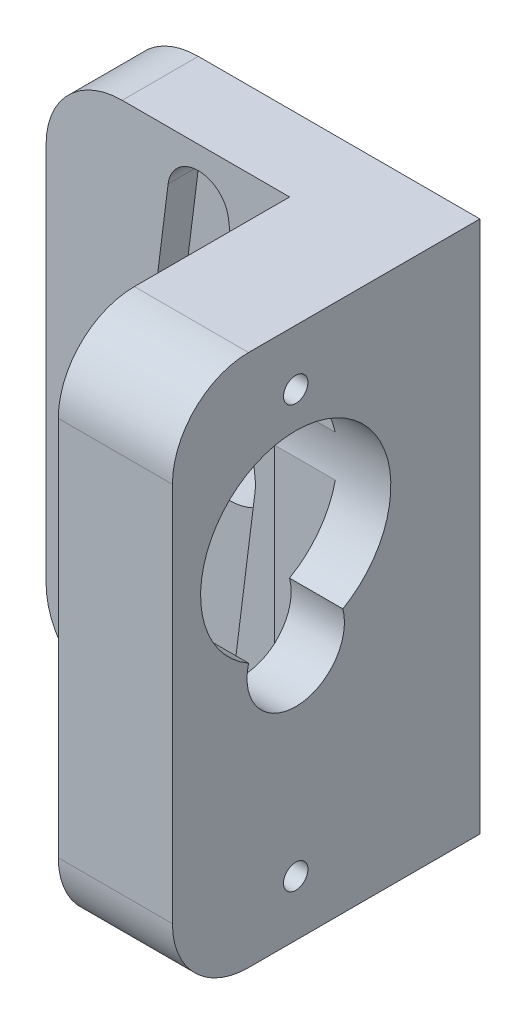
ISO-10303-21;
HEADER;
FILE_DESCRIPTION(('STEP AP214'),'2;1');
FILE_NAME('part.step','',(''),(''),'','','');
FILE_SCHEMA(('AUTOMOTIVE_DESIGN { 1 0 10303 214 1 1 1 1 }'));
ENDSEC;
DATA;
#1=APPLICATION_CONTEXT('core data for automotive mechanical design processes');
#2=APPLICATION_PROTOCOL_DEFINITION('international standard','automotive_design',2000,#1);
#3=PRODUCT_CONTEXT('',#1,'mechanical');
#4=PRODUCT('Part','Part','',(#3));
#5=PRODUCT_RELATED_PRODUCT_CATEGORY('part','',(#4));
#6=PRODUCT_DEFINITION_FORMATION('','',#4);
#7=PRODUCT_DEFINITION_CONTEXT('part definition',#1,'design');
#8=PRODUCT_DEFINITION('design','',#6,#7);
#9=PRODUCT_DEFINITION_SHAPE('','',#8);
#10=(LENGTH_UNIT() NAMED_UNIT(*) SI_UNIT(.MILLI.,.METRE.));
#11=(NAMED_UNIT(*) PLANE_ANGLE_UNIT() SI_UNIT($,.RADIAN.));
#12=(NAMED_UNIT(*) SI_UNIT($,.STERADIAN.) SOLID_ANGLE_UNIT());
#13=UNCERTAINTY_MEASURE_WITH_UNIT(LENGTH_MEASURE(1.E-05),#10,'distance_accuracy_value','');
#14=(GEOMETRIC_REPRESENTATION_CONTEXT(3) GLOBAL_UNCERTAINTY_ASSIGNED_CONTEXT((#13)) GLOBAL_UNIT_ASSIGNED_CONTEXT((#10,
#11,#12)) REPRESENTATION_CONTEXT('',''));
#15=CARTESIAN_POINT('',(0.,0.,0.));
#16=DIRECTION('',(0.,0.,1.));
#17=DIRECTION('',(1.,0.,0.));
#18=AXIS2_PLACEMENT_3D('',#15,#16,#17);
#19=CARTESIAN_POINT('',(-5.,12.5,0.));
#20=DIRECTION('',(0.,0.,1.));
#21=DIRECTION('',(1.,0.,0.));
#22=AXIS2_PLACEMENT_3D('',#19,#20,#21);
#23=PLANE('',#22);
#24=DIRECTION('',(-0.125,-0.992156741649221,0.));
#25=VECTOR('',#24,1.);
#26=CARTESIAN_POINT('',(-1.98431348329844,14.25,0.));
#27=LINE('',#26,#25);
#28=CARTESIAN_POINT('',(-1.98431348329844,14.25,0.));
#29=VERTEX_POINT('',#28);
#30=CARTESIAN_POINT('',(-3.72058778118458,0.46875,0.));
#31=VERTEX_POINT('',#30);
#32=EDGE_CURVE('E349',#29,#31,#27,.T.);
#33=ORIENTED_EDGE('',*,*,#32,.F.);
#34=CARTESIAN_POINT('',(0.,14.,0.));
#35=DIRECTION('',(0.,0.,1.));
#36=DIRECTION('',(1.,0.,0.));
#37=AXIS2_PLACEMENT_3D('',#34,#35,#36);
#38=CIRCLE('',#37,2.);
#39=CARTESIAN_POINT('',(1.98431348329844,14.25,0.));
#40=VERTEX_POINT('',#39);
#41=EDGE_CURVE('E373',#40,#29,#38,.T.);
#42=ORIENTED_EDGE('',*,*,#41,.F.);
#43=DIRECTION('',(-0.125,0.992156741649221,0.));
#44=VECTOR('',#43,1.);
#45=CARTESIAN_POINT('',(1.98431348329844,14.25,0.));
#46=LINE('',#45,#44);
#47=CARTESIAN_POINT('',(3.72058778118458,0.46875,0.));
#48=VERTEX_POINT('',#47);
#49=EDGE_CURVE('E370',#48,#40,#46,.T.);
#50=ORIENTED_EDGE('',*,*,#49,.F.);
#51=CARTESIAN_POINT('',(0.,0.,0.));
#52=DIRECTION('',(0.,0.,1.));
#53=DIRECTION('',(1.,0.,0.));
#54=AXIS2_PLACEMENT_3D('',#51,#52,#53);
#55=CIRCLE('',#54,3.75);
#56=CARTESIAN_POINT('',(3.72058778118458,-0.468750000000001,0.));
#57=VERTEX_POINT('',#56);
#58=EDGE_CURVE('E380',#57,#48,#55,.T.);
#59=ORIENTED_EDGE('',*,*,#58,.F.);
#60=DIRECTION('',(0.125,0.992156741649221,0.));
#61=VECTOR('',#60,1.);
#62=CARTESIAN_POINT('',(1.98431348329844,-14.25,0.));
#63=LINE('',#62,#61);
#64=CARTESIAN_POINT('',(1.98431348329844,-14.25,0.));
#65=VERTEX_POINT('',#64);
#66=EDGE_CURVE('E368',#65,#57,#63,.T.);
#67=ORIENTED_EDGE('',*,*,#66,.F.);
#68=CARTESIAN_POINT('',(0.,-14.,0.));
#69=DIRECTION('',(0.,0.,1.));
#70=DIRECTION('',(1.,0.,0.));
#71=AXIS2_PLACEMENT_3D('',#68,#69,#70);
#72=CIRCLE('',#71,2.);
#73=CARTESIAN_POINT('',(-1.98431348329844,-14.25,0.));
#74=VERTEX_POINT('',#73);
#75=EDGE_CURVE('E365',#74,#65,#72,.T.);
#76=ORIENTED_EDGE('',*,*,#75,.F.);
#77=DIRECTION('',(0.125,-0.992156741649221,0.));
#78=VECTOR('',#77,1.);
#79=CARTESIAN_POINT('',(-3.72058778118458,-0.46875,0.));
#80=LINE('',#79,#78);
#81=CARTESIAN_POINT('',(-3.72058778118458,-0.46875,0.));
#82=VERTEX_POINT('',#81);
#83=EDGE_CURVE('E344',#82,#74,#80,.T.);
#84=ORIENTED_EDGE('',*,*,#83,.F.);
#85=EDGE_CURVE('E399',#31,#82,#55,.T.);
#86=ORIENTED_EDGE('',*,*,#85,.F.);
#87=EDGE_LOOP('',(#33,#42,#50,#59,#67,#76,#84,#86));
#88=FACE_BOUND('',#87,.T.);
#89=DIRECTION('',(1.,0.,0.));
#90=VECTOR('',#89,1.);
#91=CARTESIAN_POINT('',(10.,-17.5,0.));
#92=LINE('',#91,#90);
#93=CARTESIAN_POINT('',(-4.99999999999999,-17.5,0.));
#94=VERTEX_POINT('',#93);
#95=CARTESIAN_POINT('',(6.,-17.5,0.));
#96=VERTEX_POINT('',#95);
#97=EDGE_CURVE('E405',#94,#96,#92,.T.);
#98=ORIENTED_EDGE('',*,*,#97,.T.);
#99=DIRECTION('',(0.,1.,0.));
#100=VECTOR('',#99,1.);
#101=CARTESIAN_POINT('',(6.,12.5,0.));
#102=LINE('',#101,#100);
#103=CARTESIAN_POINT('',(6.,17.5,0.));
#104=VERTEX_POINT('',#103);
#105=EDGE_CURVE('E440',#96,#104,#102,.T.);
#106=ORIENTED_EDGE('',*,*,#105,.T.);
#107=DIRECTION('',(-1.,0.,0.));
#108=VECTOR('',#107,1.);
#109=CARTESIAN_POINT('',(10.,17.5,0.));
#110=LINE('',#109,#108);
#111=CARTESIAN_POINT('',(-5.,17.5,0.));
#112=VERTEX_POINT('',#111);
#113=EDGE_CURVE('E398',#104,#112,#110,.T.);
#114=ORIENTED_EDGE('',*,*,#113,.T.);
#115=CARTESIAN_POINT('',(-5.,12.5,0.));
#116=DIRECTION('',(0.,0.,1.));
#117=DIRECTION('',(1.,0.,0.));
#118=AXIS2_PLACEMENT_3D('',#115,#116,#117);
#119=CIRCLE('',#118,5.);
#120=CARTESIAN_POINT('',(-9.99999999999999,12.5,0.));
#121=VERTEX_POINT('',#120);
#122=EDGE_CURVE('E418',#112,#121,#119,.T.);
#123=ORIENTED_EDGE('',*,*,#122,.T.);
#124=DIRECTION('',(0.,-1.,0.));
#125=VECTOR('',#124,1.);
#126=CARTESIAN_POINT('',(-10.,-12.5,0.));
#127=LINE('',#126,#125);
#128=CARTESIAN_POINT('',(-10.,-12.5,0.));
#129=VERTEX_POINT('',#128);
#130=EDGE_CURVE('E421',#121,#129,#127,.T.);
#131=ORIENTED_EDGE('',*,*,#130,.T.);
#132=CARTESIAN_POINT('',(-5.,-12.5,0.));
#133=DIRECTION('',(0.,0.,1.));
#134=DIRECTION('',(-1.,0.,0.));
#135=AXIS2_PLACEMENT_3D('',#132,#133,#134);
#136=CIRCLE('',#135,5.);
#137=EDGE_CURVE('E424',#129,#94,#136,.T.);
#138=ORIENTED_EDGE('',*,*,#137,.T.);
#139=EDGE_LOOP('',(#98,#106,#114,#123,#131,#138));
#140=FACE_BOUND('',#139,.T.);
#141=ADVANCED_FACE('F42',(#88,#140),#23,.T.);
#142=CARTESIAN_POINT('',(0.,0.,-5.));
#143=DIRECTION('',(0.,0.,1.));
#144=DIRECTION('',(1.,0.,0.));
#145=AXIS2_PLACEMENT_3D('',#142,#143,#144);
#146=CYLINDRICAL_SURFACE('',#145,3.75);
#147=CARTESIAN_POINT('',(0.,0.,-5.));
#148=DIRECTION('',(0.,0.,1.));
#149=DIRECTION('',(1.,0.,0.));
#150=AXIS2_PLACEMENT_3D('',#147,#148,#149);
#151=CIRCLE('',#150,3.75);
#152=CARTESIAN_POINT('',(3.75,0.,-5.));
#153=VERTEX_POINT('',#152);
#154=EDGE_CURVE('E395',#153,#153,#151,.T.);
#155=ORIENTED_EDGE('',*,*,#154,.F.);
#156=EDGE_LOOP('',(#155));
#157=FACE_BOUND('',#156,.T.);
#158=CARTESIAN_POINT('',(0.,0.,-2.));
#159=DIRECTION('',(0.,0.,1.));
#160=DIRECTION('',(1.,0.,0.));
#161=AXIS2_PLACEMENT_3D('',#158,#159,#160);
#162=CIRCLE('',#161,3.75);
#163=CARTESIAN_POINT('',(3.72058778118458,-0.468750000000001,-2.));
#164=VERTEX_POINT('',#163);
#165=CARTESIAN_POINT('',(-3.72058778118458,-0.46875,-2.));
#166=VERTEX_POINT('',#165);
#167=EDGE_CURVE('E438',#164,#166,#162,.F.);
#168=ORIENTED_EDGE('',*,*,#167,.F.);
#169=DIRECTION('',(0.,0.,1.));
#170=VECTOR('',#169,1.);
#171=CARTESIAN_POINT('',(3.72058778118458,-0.468750000000001,-2.));
#172=LINE('',#171,#170);
#173=EDGE_CURVE('E387',#164,#57,#172,.T.);
#174=ORIENTED_EDGE('',*,*,#173,.T.);
#175=ORIENTED_EDGE('',*,*,#58,.T.);
#176=DIRECTION('',(0.,0.,1.));
#177=VECTOR('',#176,1.);
#178=CARTESIAN_POINT('',(3.72058778118458,0.46875,-2.));
#179=LINE('',#178,#177);
#180=CARTESIAN_POINT('',(3.72058778118458,0.46875,-2.));
#181=VERTEX_POINT('',#180);
#182=EDGE_CURVE('E385',#181,#48,#179,.T.);
#183=ORIENTED_EDGE('',*,*,#182,.F.);
#184=CARTESIAN_POINT('',(-3.72058778118458,0.46875,-2.));
#185=VERTEX_POINT('',#184);
#186=EDGE_CURVE('E431',#185,#181,#162,.F.);
#187=ORIENTED_EDGE('',*,*,#186,.F.);
#188=DIRECTION('',(0.,0.,1.));
#189=VECTOR('',#188,1.);
#190=CARTESIAN_POINT('',(-3.72058778118458,0.46875,-2.));
#191=LINE('',#190,#189);
#192=EDGE_CURVE('E377',#185,#31,#191,.T.);
#193=ORIENTED_EDGE('',*,*,#192,.T.);
#194=ORIENTED_EDGE('',*,*,#85,.T.);
#195=DIRECTION('',(0.,0.,1.));
#196=VECTOR('',#195,1.);
#197=CARTESIAN_POINT('',(-3.72058778118458,-0.46875,-2.));
#198=LINE('',#197,#196);
#199=EDGE_CURVE('E362',#166,#82,#198,.T.);
#200=ORIENTED_EDGE('',*,*,#199,.F.);
#201=EDGE_LOOP('',(#168,#174,#175,#183,#187,#193,#194,#200));
#202=FACE_BOUND('',#201,.T.);
#203=ADVANCED_FACE('F483',(#157,#202),#146,.F.);
#204=CARTESIAN_POINT('',(10.,-17.5,-5.));
#205=DIRECTION('',(0.,-1.,0.));
#206=DIRECTION('',(1.,0.,0.));
#207=AXIS2_PLACEMENT_3D('',#204,#205,#206);
#208=PLANE('',#207);
#209=DIRECTION('',(0.,0.,-1.));
#210=VECTOR('',#209,1.);
#211=CARTESIAN_POINT('',(6.,-17.5,-5.));
#212=LINE('',#211,#210);
#213=CARTESIAN_POINT('',(6.,-17.5,10.2));
#214=VERTEX_POINT('',#213);
#215=EDGE_CURVE('E301',#214,#96,#212,.T.);
#216=ORIENTED_EDGE('',*,*,#215,.T.);
#217=ORIENTED_EDGE('',*,*,#97,.F.);
#218=DIRECTION('',(0.,0.,1.));
#219=VECTOR('',#218,1.);
#220=CARTESIAN_POINT('',(-4.99999999999999,-17.5,-5.));
#221=LINE('',#220,#219);
#222=CARTESIAN_POINT('',(-4.99999999999999,-17.5,-5.));
#223=VERTEX_POINT('',#222);
#224=EDGE_CURVE('E429',#223,#94,#221,.T.);
#225=ORIENTED_EDGE('',*,*,#224,.F.);
#226=DIRECTION('',(1.,0.,0.));
#227=VECTOR('',#226,1.);
#228=CARTESIAN_POINT('',(10.,-17.5,-5.));
#229=LINE('',#228,#227);
#230=CARTESIAN_POINT('',(13.5,-17.5,-5.));
#231=VERTEX_POINT('',#230);
#232=EDGE_CURVE('E414',#223,#231,#229,.T.);
#233=ORIENTED_EDGE('',*,*,#232,.T.);
#234=DIRECTION('',(0.,0.,-1.));
#235=VECTOR('',#234,1.);
#236=CARTESIAN_POINT('',(13.5,-17.5,-5.));
#237=LINE('',#236,#235);
#238=CARTESIAN_POINT('',(13.5,-17.5,10.2));
#239=VERTEX_POINT('',#238);
#240=EDGE_CURVE('E332',#239,#231,#237,.T.);
#241=ORIENTED_EDGE('',*,*,#240,.F.);
#242=DIRECTION('',(-1.,0.,0.));
#243=VECTOR('',#242,1.);
#244=CARTESIAN_POINT('',(13.5,-17.5,10.2));
#245=LINE('',#244,#243);
#246=EDGE_CURVE('E335',#239,#214,#245,.T.);
#247=ORIENTED_EDGE('',*,*,#246,.T.);
#248=EDGE_LOOP('',(#216,#217,#225,#233,#241,#247));
#249=FACE_BOUND('',#248,.T.);
#250=ADVANCED_FACE('F489',(#249),#208,.T.);
#251=CARTESIAN_POINT('',(-5.,-12.5,-5.));
#252=DIRECTION('',(0.,0.,1.));
#253=DIRECTION('',(1.,0.,0.));
#254=AXIS2_PLACEMENT_3D('',#251,#252,#253);
#255=CYLINDRICAL_SURFACE('',#254,5.);
#256=ORIENTED_EDGE('',*,*,#137,.F.);
#257=DIRECTION('',(0.,0.,1.));
#258=VECTOR('',#257,1.);
#259=CARTESIAN_POINT('',(-10.,-12.5,-5.));
#260=LINE('',#259,#258);
#261=CARTESIAN_POINT('',(-10.,-12.5,-5.));
#262=VERTEX_POINT('',#261);
#263=EDGE_CURVE('E432',#262,#129,#260,.T.);
#264=ORIENTED_EDGE('',*,*,#263,.F.);
#265=CARTESIAN_POINT('',(-5.,-12.5,-5.));
#266=DIRECTION('',(0.,0.,1.));
#267=DIRECTION('',(-1.,0.,0.));
#268=AXIS2_PLACEMENT_3D('',#265,#266,#267);
#269=CIRCLE('',#268,5.);
#270=EDGE_CURVE('E411',#262,#223,#269,.T.);
#271=ORIENTED_EDGE('',*,*,#270,.T.);
#272=ORIENTED_EDGE('',*,*,#224,.T.);
#273=EDGE_LOOP('',(#256,#264,#271,#272));
#274=FACE_BOUND('',#273,.T.);
#275=ADVANCED_FACE('F499',(#274),#255,.T.);
#276=CARTESIAN_POINT('',(-10.,-12.5,-5.));
#277=DIRECTION('',(-1.,0.,0.));
#278=DIRECTION('',(0.,-1.,0.));
#279=AXIS2_PLACEMENT_3D('',#276,#277,#278);
#280=PLANE('',#279);
#281=ORIENTED_EDGE('',*,*,#130,.F.);
#282=DIRECTION('',(0.,0.,1.));
#283=VECTOR('',#282,1.);
#284=CARTESIAN_POINT('',(-9.99999999999999,12.5,-5.));
#285=LINE('',#284,#283);
#286=CARTESIAN_POINT('',(-9.99999999999999,12.5,-5.));
#287=VERTEX_POINT('',#286);
#288=EDGE_CURVE('E434',#287,#121,#285,.T.);
#289=ORIENTED_EDGE('',*,*,#288,.F.);
#290=DIRECTION('',(0.,-1.,0.));
#291=VECTOR('',#290,1.);
#292=CARTESIAN_POINT('',(-10.,-12.5,-5.));
#293=LINE('',#292,#291);
#294=EDGE_CURVE('E408',#287,#262,#293,.T.);
#295=ORIENTED_EDGE('',*,*,#294,.T.);
#296=ORIENTED_EDGE('',*,*,#263,.T.);
#297=EDGE_LOOP('',(#281,#289,#295,#296));
#298=FACE_BOUND('',#297,.T.);
#299=ADVANCED_FACE('F503',(#298),#280,.T.);
#300=CARTESIAN_POINT('',(-5.,12.5,-5.));
#301=DIRECTION('',(0.,0.,1.));
#302=DIRECTION('',(1.,0.,0.));
#303=AXIS2_PLACEMENT_3D('',#300,#301,#302);
#304=CYLINDRICAL_SURFACE('',#303,5.);
#305=ORIENTED_EDGE('',*,*,#122,.F.);
#306=DIRECTION('',(0.,0.,1.));
#307=VECTOR('',#306,1.);
#308=CARTESIAN_POINT('',(-5.,17.5,-5.));
#309=LINE('',#308,#307);
#310=CARTESIAN_POINT('',(-5.,17.5,-5.));
#311=VERTEX_POINT('',#310);
#312=EDGE_CURVE('E416',#311,#112,#309,.T.);
#313=ORIENTED_EDGE('',*,*,#312,.F.);
#314=CARTESIAN_POINT('',(-5.,12.5,-5.));
#315=DIRECTION('',(0.,0.,1.));
#316=DIRECTION('',(1.,0.,0.));
#317=AXIS2_PLACEMENT_3D('',#314,#315,#316);
#318=CIRCLE('',#317,5.);
#319=EDGE_CURVE('E404',#311,#287,#318,.T.);
#320=ORIENTED_EDGE('',*,*,#319,.T.);
#321=ORIENTED_EDGE('',*,*,#288,.T.);
#322=EDGE_LOOP('',(#305,#313,#320,#321));
#323=FACE_BOUND('',#322,.T.);
#324=ADVANCED_FACE('F506',(#323),#304,.T.);
#325=CARTESIAN_POINT('',(10.,17.5,-5.));
#326=DIRECTION('',(0.,1.,0.));
#327=DIRECTION('',(-1.,0.,0.));
#328=AXIS2_PLACEMENT_3D('',#325,#326,#327);
#329=PLANE('',#328);
#330=DIRECTION('',(-1.,0.,0.));
#331=VECTOR('',#330,1.);
#332=CARTESIAN_POINT('',(10.,17.5,-5.));
#333=LINE('',#332,#331);
#334=CARTESIAN_POINT('',(13.5,17.5,-5.));
#335=VERTEX_POINT('',#334);
#336=EDGE_CURVE('E402',#335,#311,#333,.T.);
#337=ORIENTED_EDGE('',*,*,#336,.T.);
#338=ORIENTED_EDGE('',*,*,#312,.T.);
#339=ORIENTED_EDGE('',*,*,#113,.F.);
#340=DIRECTION('',(0.,0.,1.));
#341=VECTOR('',#340,1.);
#342=CARTESIAN_POINT('',(6.,17.5,-5.));
#343=LINE('',#342,#341);
#344=CARTESIAN_POINT('',(6.,17.5,10.2));
#345=VERTEX_POINT('',#344);
#346=EDGE_CURVE('E290',#104,#345,#343,.T.);
#347=ORIENTED_EDGE('',*,*,#346,.T.);
#348=DIRECTION('',(-1.,0.,0.));
#349=VECTOR('',#348,1.);
#350=CARTESIAN_POINT('',(13.5,17.5,10.2));
#351=LINE('',#350,#349);
#352=CARTESIAN_POINT('',(13.5,17.5,10.2));
#353=VERTEX_POINT('',#352);
#354=EDGE_CURVE('E341',#353,#345,#351,.T.);
#355=ORIENTED_EDGE('',*,*,#354,.F.);
#356=DIRECTION('',(0.,0.,1.));
#357=VECTOR('',#356,1.);
#358=CARTESIAN_POINT('',(13.5,17.5,-5.));
#359=LINE('',#358,#357);
#360=EDGE_CURVE('E324',#335,#353,#359,.T.);
#361=ORIENTED_EDGE('',*,*,#360,.F.);
#362=EDGE_LOOP('',(#337,#338,#339,#347,#355,#361));
#363=FACE_BOUND('',#362,.T.);
#364=ADVANCED_FACE('F44',(#363),#329,.T.);
#365=CARTESIAN_POINT('',(-5.,12.5,-5.));
#366=DIRECTION('',(0.,0.,1.));
#367=DIRECTION('',(1.,0.,0.));
#368=AXIS2_PLACEMENT_3D('',#365,#366,#367);
#369=PLANE('',#368);
#370=DIRECTION('',(0.,1.,0.));
#371=VECTOR('',#370,1.);
#372=CARTESIAN_POINT('',(13.5,17.5,-5.));
#373=LINE('',#372,#371);
#374=EDGE_CURVE('E321',#231,#335,#373,.T.);
#375=ORIENTED_EDGE('',*,*,#374,.F.);
#376=ORIENTED_EDGE('',*,*,#232,.F.);
#377=ORIENTED_EDGE('',*,*,#270,.F.);
#378=ORIENTED_EDGE('',*,*,#294,.F.);
#379=ORIENTED_EDGE('',*,*,#319,.F.);
#380=ORIENTED_EDGE('',*,*,#336,.F.);
#381=EDGE_LOOP('',(#375,#376,#377,#378,#379,#380));
#382=FACE_BOUND('',#381,.T.);
#383=ORIENTED_EDGE('',*,*,#154,.T.);
#384=EDGE_LOOP('',(#383));
#385=FACE_BOUND('',#384,.T.);
#386=ADVANCED_FACE('F496',(#382,#385),#369,.F.);
#387=CARTESIAN_POINT('',(0.,0.,-2.));
#388=DIRECTION('',(0.,0.,1.));
#389=DIRECTION('',(1.,0.,0.));
#390=AXIS2_PLACEMENT_3D('',#387,#388,#389);
#391=PLANE('',#390);
#392=ORIENTED_EDGE('',*,*,#186,.T.);
#393=DIRECTION('',(-0.125,0.992156741649221,0.));
#394=VECTOR('',#393,1.);
#395=CARTESIAN_POINT('',(1.98431348329844,14.25,-2.));
#396=LINE('',#395,#394);
#397=CARTESIAN_POINT('',(1.98431348329844,14.25,-2.));
#398=VERTEX_POINT('',#397);
#399=EDGE_CURVE('E354',#181,#398,#396,.T.);
#400=ORIENTED_EDGE('',*,*,#399,.T.);
#401=CARTESIAN_POINT('',(0.,14.,-2.));
#402=DIRECTION('',(0.,0.,1.));
#403=DIRECTION('',(1.,0.,0.));
#404=AXIS2_PLACEMENT_3D('',#401,#402,#403);
#405=CIRCLE('',#404,2.);
#406=CARTESIAN_POINT('',(-1.98431348329844,14.25,-2.));
#407=VERTEX_POINT('',#406);
#408=EDGE_CURVE('E357',#398,#407,#405,.T.);
#409=ORIENTED_EDGE('',*,*,#408,.T.);
#410=DIRECTION('',(-0.125,-0.992156741649221,0.));
#411=VECTOR('',#410,1.);
#412=CARTESIAN_POINT('',(-1.98431348329844,14.25,-2.));
#413=LINE('',#412,#411);
#414=EDGE_CURVE('E360',#407,#185,#413,.T.);
#415=ORIENTED_EDGE('',*,*,#414,.T.);
#416=EDGE_LOOP('',(#392,#400,#409,#415));
#417=FACE_BOUND('',#416,.T.);
#418=ADVANCED_FACE('F567',(#417),#391,.T.);
#419=CARTESIAN_POINT('',(1.98431348329844,14.25,-2.));
#420=DIRECTION('',(0.992156741649222,0.125,0.));
#421=DIRECTION('',(-0.125,0.992156741649222,0.));
#422=AXIS2_PLACEMENT_3D('',#419,#420,#421);
#423=PLANE('',#422);
#424=ORIENTED_EDGE('',*,*,#49,.T.);
#425=DIRECTION('',(0.,0.,1.));
#426=VECTOR('',#425,1.);
#427=CARTESIAN_POINT('',(1.98431348329844,14.25,-2.));
#428=LINE('',#427,#426);
#429=EDGE_CURVE('E383',#398,#40,#428,.T.);
#430=ORIENTED_EDGE('',*,*,#429,.F.);
#431=ORIENTED_EDGE('',*,*,#399,.F.);
#432=ORIENTED_EDGE('',*,*,#182,.T.);
#433=EDGE_LOOP('',(#424,#430,#431,#432));
#434=FACE_BOUND('',#433,.T.);
#435=ADVANCED_FACE('F571',(#434),#423,.F.);
#436=CARTESIAN_POINT('',(-1.98431348329844,14.25,-2.));
#437=DIRECTION('',(-0.992156741649222,0.125,0.));
#438=DIRECTION('',(-0.125,-0.992156741649222,0.));
#439=AXIS2_PLACEMENT_3D('',#436,#437,#438);
#440=PLANE('',#439);
#441=ORIENTED_EDGE('',*,*,#32,.T.);
#442=ORIENTED_EDGE('',*,*,#192,.F.);
#443=ORIENTED_EDGE('',*,*,#414,.F.);
#444=DIRECTION('',(0.,0.,1.));
#445=VECTOR('',#444,1.);
#446=CARTESIAN_POINT('',(-1.98431348329844,14.25,-2.));
#447=LINE('',#446,#445);
#448=EDGE_CURVE('E381',#407,#29,#447,.T.);
#449=ORIENTED_EDGE('',*,*,#448,.T.);
#450=EDGE_LOOP('',(#441,#442,#443,#449));
#451=FACE_BOUND('',#450,.T.);
#452=ADVANCED_FACE('F568',(#451),#440,.F.);
#453=CARTESIAN_POINT('',(0.,14.,-2.));
#454=DIRECTION('',(0.,0.,1.));
#455=DIRECTION('',(1.,0.,0.));
#456=AXIS2_PLACEMENT_3D('',#453,#454,#455);
#457=CYLINDRICAL_SURFACE('',#456,2.);
#458=ORIENTED_EDGE('',*,*,#41,.T.);
#459=ORIENTED_EDGE('',*,*,#448,.F.);
#460=ORIENTED_EDGE('',*,*,#408,.F.);
#461=ORIENTED_EDGE('',*,*,#429,.T.);
#462=EDGE_LOOP('',(#458,#459,#460,#461));
#463=FACE_BOUND('',#462,.T.);
#464=ADVANCED_FACE('F565',(#463),#457,.F.);
#465=ORIENTED_EDGE('',*,*,#167,.T.);
#466=DIRECTION('',(0.125,-0.992156741649221,0.));
#467=VECTOR('',#466,1.);
#468=CARTESIAN_POINT('',(-3.72058778118458,-0.46875,-2.));
#469=LINE('',#468,#467);
#470=CARTESIAN_POINT('',(-1.98431348329844,-14.25,-2.));
#471=VERTEX_POINT('',#470);
#472=EDGE_CURVE('E345',#166,#471,#469,.T.);
#473=ORIENTED_EDGE('',*,*,#472,.T.);
#474=CARTESIAN_POINT('',(0.,-14.,-2.));
#475=DIRECTION('',(0.,0.,1.));
#476=DIRECTION('',(1.,0.,0.));
#477=AXIS2_PLACEMENT_3D('',#474,#475,#476);
#478=CIRCLE('',#477,2.);
#479=CARTESIAN_POINT('',(1.98431348329844,-14.25,-2.));
#480=VERTEX_POINT('',#479);
#481=EDGE_CURVE('E348',#471,#480,#478,.T.);
#482=ORIENTED_EDGE('',*,*,#481,.T.);
#483=DIRECTION('',(0.125,0.992156741649221,0.));
#484=VECTOR('',#483,1.);
#485=CARTESIAN_POINT('',(1.98431348329844,-14.25,-2.));
#486=LINE('',#485,#484);
#487=EDGE_CURVE('E352',#480,#164,#486,.T.);
#488=ORIENTED_EDGE('',*,*,#487,.T.);
#489=EDGE_LOOP('',(#465,#473,#482,#488));
#490=FACE_BOUND('',#489,.T.);
#491=ADVANCED_FACE('F561',(#490),#391,.T.);
#492=CARTESIAN_POINT('',(1.98431348329844,-14.25,-2.));
#493=DIRECTION('',(0.992156741649222,-0.125,0.));
#494=DIRECTION('',(0.125,0.992156741649222,0.));
#495=AXIS2_PLACEMENT_3D('',#492,#493,#494);
#496=PLANE('',#495);
#497=ORIENTED_EDGE('',*,*,#66,.T.);
#498=ORIENTED_EDGE('',*,*,#173,.F.);
#499=ORIENTED_EDGE('',*,*,#487,.F.);
#500=DIRECTION('',(0.,0.,1.));
#501=VECTOR('',#500,1.);
#502=CARTESIAN_POINT('',(1.98431348329844,-14.25,-2.));
#503=LINE('',#502,#501);
#504=EDGE_CURVE('E390',#480,#65,#503,.T.);
#505=ORIENTED_EDGE('',*,*,#504,.T.);
#506=EDGE_LOOP('',(#497,#498,#499,#505));
#507=FACE_BOUND('',#506,.T.);
#508=ADVANCED_FACE('F564',(#507),#496,.F.);
#509=CARTESIAN_POINT('',(0.,-14.,-2.));
#510=DIRECTION('',(0.,0.,1.));
#511=DIRECTION('',(1.,0.,0.));
#512=AXIS2_PLACEMENT_3D('',#509,#510,#511);
#513=CYLINDRICAL_SURFACE('',#512,2.);
#514=ORIENTED_EDGE('',*,*,#75,.T.);
#515=ORIENTED_EDGE('',*,*,#504,.F.);
#516=ORIENTED_EDGE('',*,*,#481,.F.);
#517=DIRECTION('',(0.,0.,1.));
#518=VECTOR('',#517,1.);
#519=CARTESIAN_POINT('',(-1.98431348329844,-14.25,-2.));
#520=LINE('',#519,#518);
#521=EDGE_CURVE('E392',#471,#74,#520,.T.);
#522=ORIENTED_EDGE('',*,*,#521,.T.);
#523=EDGE_LOOP('',(#514,#515,#516,#522));
#524=FACE_BOUND('',#523,.T.);
#525=ADVANCED_FACE('F581',(#524),#513,.F.);
#526=CARTESIAN_POINT('',(-3.72058778118458,-0.46875,-2.));
#527=DIRECTION('',(-0.992156741649222,-0.125,0.));
#528=DIRECTION('',(0.125,-0.992156741649222,0.));
#529=AXIS2_PLACEMENT_3D('',#526,#527,#528);
#530=PLANE('',#529);
#531=ORIENTED_EDGE('',*,*,#83,.T.);
#532=ORIENTED_EDGE('',*,*,#521,.F.);
#533=ORIENTED_EDGE('',*,*,#472,.F.);
#534=ORIENTED_EDGE('',*,*,#199,.T.);
#535=EDGE_LOOP('',(#531,#532,#533,#534));
#536=FACE_BOUND('',#535,.T.);
#537=ADVANCED_FACE('F585',(#536),#530,.F.);
#538=CARTESIAN_POINT('',(13.5,-12.5,10.2));
#539=DIRECTION('',(1.,0.,0.));
#540=DIRECTION('',(0.,0.,-1.));
#541=AXIS2_PLACEMENT_3D('',#538,#539,#540);
#542=PLANE('',#541);
#543=CARTESIAN_POINT('',(13.5,13.8499999999957,7.09999999999775));
#544=DIRECTION('',(1.,0.,0.));
#545=DIRECTION('',(0.,0.,-1.));
#546=AXIS2_PLACEMENT_3D('',#543,#544,#545);
#547=CIRCLE('',#546,0.7999999999991);
#548=CARTESIAN_POINT('',(13.5,13.8499999999957,6.29999999999865));
#549=VERTEX_POINT('',#548);
#550=EDGE_CURVE('E318',#549,#549,#547,.T.);
#551=ORIENTED_EDGE('',*,*,#550,.F.);
#552=EDGE_LOOP('',(#551));
#553=FACE_BOUND('',#552,.T.);
#554=ORIENTED_EDGE('',*,*,#374,.T.);
#555=ORIENTED_EDGE('',*,*,#360,.T.);
#556=CARTESIAN_POINT('',(13.5,12.5,10.2));
#557=DIRECTION('',(1.,0.,0.));
#558=DIRECTION('',(0.,0.,1.));
#559=AXIS2_PLACEMENT_3D('',#556,#557,#558);
#560=CIRCLE('',#559,5.);
#561=CARTESIAN_POINT('',(13.5,12.5,15.2));
#562=VERTEX_POINT('',#561);
#563=EDGE_CURVE('E326',#353,#562,#560,.T.);
#564=ORIENTED_EDGE('',*,*,#563,.T.);
#565=DIRECTION('',(0.,-1.,0.));
#566=VECTOR('',#565,1.);
#567=CARTESIAN_POINT('',(13.5,12.5,15.2));
#568=LINE('',#567,#566);
#569=CARTESIAN_POINT('',(13.5,-12.5,15.2));
#570=VERTEX_POINT('',#569);
#571=EDGE_CURVE('E328',#562,#570,#568,.T.);
#572=ORIENTED_EDGE('',*,*,#571,.T.);
#573=CARTESIAN_POINT('',(13.5,-12.5,10.2));
#574=DIRECTION('',(1.,0.,0.));
#575=DIRECTION('',(0.,0.,-1.));
#576=AXIS2_PLACEMENT_3D('',#573,#574,#575);
#577=CIRCLE('',#576,5.);
#578=EDGE_CURVE('E330',#570,#239,#577,.T.);
#579=ORIENTED_EDGE('',*,*,#578,.T.);
#580=ORIENTED_EDGE('',*,*,#240,.T.);
#581=EDGE_LOOP('',(#554,#555,#564,#572,#579,#580));
#582=FACE_BOUND('',#581,.T.);
#583=CARTESIAN_POINT('',(13.5,-13.8500000000043,7.09999999999774));
#584=DIRECTION('',(1.,0.,0.));
#585=DIRECTION('',(0.,0.,-1.));
#586=AXIS2_PLACEMENT_3D('',#583,#584,#585);
#587=CIRCLE('',#586,0.7999999999991);
#588=CARTESIAN_POINT('',(13.5,-13.8500000000043,6.29999999999864));
#589=VERTEX_POINT('',#588);
#590=EDGE_CURVE('E315',#589,#589,#587,.T.);
#591=ORIENTED_EDGE('',*,*,#590,.F.);
#592=EDGE_LOOP('',(#591));
#593=FACE_BOUND('',#592,.T.);
#594=CARTESIAN_POINT('',(13.5,5.24999999999129,7.09999999999775));
#595=DIRECTION('',(1.,0.,0.));
#596=DIRECTION('',(0.,0.,-1.));
#597=AXIS2_PLACEMENT_3D('',#594,#595,#596);
#598=CIRCLE('',#597,6.25);
#599=CARTESIAN_POINT('',(13.5,-0.180800000008717,4.00663429901767));
#600=VERTEX_POINT('',#599);
#601=CARTESIAN_POINT('',(13.5,-0.180800000008715,10.1933657009778));
#602=VERTEX_POINT('',#601);
#603=EDGE_CURVE('E307',#600,#602,#598,.T.);
#604=ORIENTED_EDGE('',*,*,#603,.F.);
#605=CARTESIAN_POINT('',(13.5,-1.00000000000871,7.09999999999775));
#606=DIRECTION('',(1.,0.,0.));
#607=DIRECTION('',(0.,0.,-1.));
#608=AXIS2_PLACEMENT_3D('',#605,#606,#607);
#609=CIRCLE('',#608,3.2);
#610=EDGE_CURVE('E304',#602,#600,#609,.T.);
#611=ORIENTED_EDGE('',*,*,#610,.F.);
#612=EDGE_LOOP('',(#604,#611));
#613=FACE_BOUND('',#612,.T.);
#614=ADVANCED_FACE('F542',(#553,#582,#593,#613),#542,.T.);
#615=CARTESIAN_POINT('',(13.5,12.5,10.2));
#616=DIRECTION('',(-1.,0.,0.));
#617=DIRECTION('',(0.,0.,1.));
#618=AXIS2_PLACEMENT_3D('',#615,#616,#617);
#619=CYLINDRICAL_SURFACE('',#618,5.);
#620=ORIENTED_EDGE('',*,*,#354,.T.);
#621=CARTESIAN_POINT('',(6.,12.5,10.2));
#622=DIRECTION('',(1.,0.,0.));
#623=DIRECTION('',(0.,0.,1.));
#624=AXIS2_PLACEMENT_3D('',#621,#622,#623);
#625=CIRCLE('',#624,5.);
#626=CARTESIAN_POINT('',(6.,12.5,15.2));
#627=VERTEX_POINT('',#626);
#628=EDGE_CURVE('E292',#345,#627,#625,.T.);
#629=ORIENTED_EDGE('',*,*,#628,.T.);
#630=DIRECTION('',(-1.,0.,0.));
#631=VECTOR('',#630,1.);
#632=CARTESIAN_POINT('',(13.5,12.5,15.2));
#633=LINE('',#632,#631);
#634=EDGE_CURVE('E339',#562,#627,#633,.T.);
#635=ORIENTED_EDGE('',*,*,#634,.F.);
#636=ORIENTED_EDGE('',*,*,#563,.F.);
#637=EDGE_LOOP('',(#620,#629,#635,#636));
#638=FACE_BOUND('',#637,.T.);
#639=ADVANCED_FACE('F538',(#638),#619,.T.);
#640=CARTESIAN_POINT('',(13.5,12.5,15.2));
#641=DIRECTION('',(0.,0.,-1.));
#642=DIRECTION('',(0.,1.,0.));
#643=AXIS2_PLACEMENT_3D('',#640,#641,#642);
#644=PLANE('',#643);
#645=ORIENTED_EDGE('',*,*,#634,.T.);
#646=DIRECTION('',(0.,-1.,0.));
#647=VECTOR('',#646,1.);
#648=CARTESIAN_POINT('',(6.,12.5,15.2));
#649=LINE('',#648,#647);
#650=CARTESIAN_POINT('',(6.,-12.5,15.2));
#651=VERTEX_POINT('',#650);
#652=EDGE_CURVE('E295',#627,#651,#649,.T.);
#653=ORIENTED_EDGE('',*,*,#652,.T.);
#654=DIRECTION('',(-1.,0.,0.));
#655=VECTOR('',#654,1.);
#656=CARTESIAN_POINT('',(13.5,-12.5,15.2));
#657=LINE('',#656,#655);
#658=EDGE_CURVE('E337',#570,#651,#657,.T.);
#659=ORIENTED_EDGE('',*,*,#658,.F.);
#660=ORIENTED_EDGE('',*,*,#571,.F.);
#661=EDGE_LOOP('',(#645,#653,#659,#660));
#662=FACE_BOUND('',#661,.T.);
#663=ADVANCED_FACE('F549',(#662),#644,.F.);
#664=CARTESIAN_POINT('',(13.5,-12.5,10.2));
#665=DIRECTION('',(-1.,0.,0.));
#666=DIRECTION('',(0.,0.,1.));
#667=AXIS2_PLACEMENT_3D('',#664,#665,#666);
#668=CYLINDRICAL_SURFACE('',#667,5.);
#669=ORIENTED_EDGE('',*,*,#658,.T.);
#670=CARTESIAN_POINT('',(6.,-12.5,10.2));
#671=DIRECTION('',(1.,0.,0.));
#672=DIRECTION('',(0.,0.,-1.));
#673=AXIS2_PLACEMENT_3D('',#670,#671,#672);
#674=CIRCLE('',#673,5.);
#675=EDGE_CURVE('E298',#651,#214,#674,.T.);
#676=ORIENTED_EDGE('',*,*,#675,.T.);
#677=ORIENTED_EDGE('',*,*,#246,.F.);
#678=ORIENTED_EDGE('',*,*,#578,.F.);
#679=EDGE_LOOP('',(#669,#676,#677,#678));
#680=FACE_BOUND('',#679,.T.);
#681=ADVANCED_FACE('F547',(#680),#668,.T.);
#682=CARTESIAN_POINT('',(13.5,13.8499999999957,7.09999999999775));
#683=DIRECTION('',(-1.,0.,0.));
#684=DIRECTION('',(0.,0.,1.));
#685=AXIS2_PLACEMENT_3D('',#682,#683,#684);
#686=CYLINDRICAL_SURFACE('',#685,0.7999999999991);
#687=ORIENTED_EDGE('',*,*,#550,.T.);
#688=EDGE_LOOP('',(#687));
#689=FACE_BOUND('',#688,.T.);
#690=CARTESIAN_POINT('',(6.,13.8499999999957,7.09999999999775));
#691=DIRECTION('',(1.,0.,0.));
#692=DIRECTION('',(0.,0.,-1.));
#693=AXIS2_PLACEMENT_3D('',#690,#691,#692);
#694=CIRCLE('',#693,0.7999999999991);
#695=CARTESIAN_POINT('',(6.,13.8499999999957,6.29999999999865));
#696=VERTEX_POINT('',#695);
#697=EDGE_CURVE('E287',#696,#696,#694,.T.);
#698=ORIENTED_EDGE('',*,*,#697,.F.);
#699=EDGE_LOOP('',(#698));
#700=FACE_BOUND('',#699,.T.);
#701=ADVANCED_FACE('F556',(#689,#700),#686,.F.);
#702=CARTESIAN_POINT('',(13.5,-13.8500000000043,7.09999999999774));
#703=DIRECTION('',(-1.,0.,0.));
#704=DIRECTION('',(0.,0.,1.));
#705=AXIS2_PLACEMENT_3D('',#702,#703,#704);
#706=CYLINDRICAL_SURFACE('',#705,0.7999999999991);
#707=ORIENTED_EDGE('',*,*,#590,.T.);
#708=EDGE_LOOP('',(#707));
#709=FACE_BOUND('',#708,.T.);
#710=CARTESIAN_POINT('',(6.,-13.8500000000043,7.09999999999774));
#711=DIRECTION('',(1.,0.,0.));
#712=DIRECTION('',(0.,0.,-1.));
#713=AXIS2_PLACEMENT_3D('',#710,#711,#712);
#714=CIRCLE('',#713,0.7999999999991);
#715=CARTESIAN_POINT('',(6.,-13.8500000000043,6.29999999999864));
#716=VERTEX_POINT('',#715);
#717=EDGE_CURVE('E284',#716,#716,#714,.T.);
#718=ORIENTED_EDGE('',*,*,#717,.F.);
#719=EDGE_LOOP('',(#718));
#720=FACE_BOUND('',#719,.T.);
#721=ADVANCED_FACE('F772',(#709,#720),#706,.F.);
#722=CARTESIAN_POINT('',(13.5,-1.00000000000871,7.09999999999775));
#723=DIRECTION('',(-1.,0.,0.));
#724=DIRECTION('',(0.,0.,1.));
#725=AXIS2_PLACEMENT_3D('',#722,#723,#724);
#726=CYLINDRICAL_SURFACE('',#725,3.2);
#727=CARTESIAN_POINT('',(10.,-1.00000000000871,7.09999999999775));
#728=DIRECTION('',(1.,0.,0.));
#729=DIRECTION('',(0.,0.,-1.));
#730=AXIS2_PLACEMENT_3D('',#727,#728,#729);
#731=CIRCLE('',#730,3.2);
#732=CARTESIAN_POINT('',(10.,-0.180800000008715,10.1933657009778));
#733=VERTEX_POINT('',#732);
#734=CARTESIAN_POINT('',(10.,-0.180800000008717,4.00663429901767));
#735=VERTEX_POINT('',#734);
#736=EDGE_CURVE('E278',#733,#735,#731,.T.);
#737=ORIENTED_EDGE('',*,*,#736,.F.);
#738=DIRECTION('',(-1.,0.,0.));
#739=VECTOR('',#738,1.);
#740=CARTESIAN_POINT('',(13.5,-0.180800000008715,10.1933657009778));
#741=LINE('',#740,#739);
#742=EDGE_CURVE('E309',#602,#733,#741,.T.);
#743=ORIENTED_EDGE('',*,*,#742,.F.);
#744=ORIENTED_EDGE('',*,*,#610,.T.);
#745=DIRECTION('',(-1.,0.,0.));
#746=VECTOR('',#745,1.);
#747=CARTESIAN_POINT('',(13.5,-0.180800000008717,4.00663429901767));
#748=LINE('',#747,#746);
#749=EDGE_CURVE('E312',#600,#735,#748,.T.);
#750=ORIENTED_EDGE('',*,*,#749,.T.);
#751=EDGE_LOOP('',(#737,#743,#744,#750));
#752=FACE_BOUND('',#751,.T.);
#753=ADVANCED_FACE('F783',(#752),#726,.F.);
#754=CARTESIAN_POINT('',(13.5,5.24999999999129,7.09999999999775));
#755=DIRECTION('',(-1.,0.,0.));
#756=DIRECTION('',(0.,0.,1.));
#757=AXIS2_PLACEMENT_3D('',#754,#755,#756);
#758=CYLINDRICAL_SURFACE('',#757,6.25);
#759=DIRECTION('',(-1.,0.,0.));
#760=VECTOR('',#759,1.);
#761=CARTESIAN_POINT('',(13.5,6.61106575887294,13.1999999999977));
#762=LINE('',#761,#760);
#763=CARTESIAN_POINT('',(10.,6.61106575887294,13.1999999999977));
#764=VERTEX_POINT('',#763);
#765=CARTESIAN_POINT('',(6.,6.61106575887294,13.1999999999977));
#766=VERTEX_POINT('',#765);
#767=EDGE_CURVE('E276',#764,#766,#762,.T.);
#768=ORIENTED_EDGE('',*,*,#767,.F.);
#769=CARTESIAN_POINT('',(10.,5.24999999999129,7.09999999999775));
#770=DIRECTION('',(1.,0.,0.));
#771=DIRECTION('',(0.,0.,-1.));
#772=AXIS2_PLACEMENT_3D('',#769,#770,#771);
#773=CIRCLE('',#772,6.25);
#774=CARTESIAN_POINT('',(10.,6.61106575887288,0.999999999997741));
#775=VERTEX_POINT('',#774);
#776=EDGE_CURVE('E11',#775,#764,#773,.T.);
#777=ORIENTED_EDGE('',*,*,#776,.F.);
#778=DIRECTION('',(-1.,0.,0.));
#779=VECTOR('',#778,1.);
#780=CARTESIAN_POINT('',(13.5,6.61106575887288,0.999999999997741));
#781=LINE('',#780,#779);
#782=CARTESIAN_POINT('',(6.,6.61106575887288,0.999999999997741));
#783=VERTEX_POINT('',#782);
#784=EDGE_CURVE('E267',#783,#775,#781,.F.);
#785=ORIENTED_EDGE('',*,*,#784,.F.);
#786=CARTESIAN_POINT('',(6.,5.24999999999129,7.09999999999775));
#787=DIRECTION('',(1.,0.,0.));
#788=DIRECTION('',(0.,0.,-1.));
#789=AXIS2_PLACEMENT_3D('',#786,#787,#788);
#790=CIRCLE('',#789,6.25);
#791=CARTESIAN_POINT('',(6.,3.88893424110969,0.999999999997742));
#792=VERTEX_POINT('',#791);
#793=EDGE_CURVE('E283',#792,#783,#790,.T.);
#794=ORIENTED_EDGE('',*,*,#793,.F.);
#795=DIRECTION('',(-1.,0.,0.));
#796=VECTOR('',#795,1.);
#797=CARTESIAN_POINT('',(13.5,3.88893424110969,0.999999999997741));
#798=LINE('',#797,#796);
#799=CARTESIAN_POINT('',(10.,3.88893424110969,0.999999999997741));
#800=VERTEX_POINT('',#799);
#801=EDGE_CURVE('E66',#800,#792,#798,.T.);
#802=ORIENTED_EDGE('',*,*,#801,.F.);
#803=EDGE_CURVE('E46',#735,#800,#773,.T.);
#804=ORIENTED_EDGE('',*,*,#803,.F.);
#805=ORIENTED_EDGE('',*,*,#749,.F.);
#806=ORIENTED_EDGE('',*,*,#603,.T.);
#807=ORIENTED_EDGE('',*,*,#742,.T.);
#808=CARTESIAN_POINT('',(10.,3.88893424110963,13.1999999999977));
#809=VERTEX_POINT('',#808);
#810=EDGE_CURVE('E51',#809,#733,#773,.T.);
#811=ORIENTED_EDGE('',*,*,#810,.F.);
#812=DIRECTION('',(-1.,0.,0.));
#813=VECTOR('',#812,1.);
#814=CARTESIAN_POINT('',(13.5,3.88893424110963,13.1999999999977));
#815=LINE('',#814,#813);
#816=CARTESIAN_POINT('',(6.,3.88893424110964,13.1999999999977));
#817=VERTEX_POINT('',#816);
#818=EDGE_CURVE('E274',#817,#809,#815,.F.);
#819=ORIENTED_EDGE('',*,*,#818,.F.);
#820=EDGE_CURVE('E280',#766,#817,#790,.T.);
#821=ORIENTED_EDGE('',*,*,#820,.F.);
#822=EDGE_LOOP('',(#768,#777,#785,#794,#802,#804,#805,#806,#807,#811,#819,#821));
#823=FACE_BOUND('',#822,.T.);
#824=ADVANCED_FACE('F452',(#823),#758,.F.);
#825=CARTESIAN_POINT('',(6.,-12.5,10.2));
#826=DIRECTION('',(1.,0.,0.));
#827=DIRECTION('',(0.,0.,-1.));
#828=AXIS2_PLACEMENT_3D('',#825,#826,#827);
#829=PLANE('',#828);
#830=ORIENTED_EDGE('',*,*,#105,.F.);
#831=ORIENTED_EDGE('',*,*,#215,.F.);
#832=ORIENTED_EDGE('',*,*,#675,.F.);
#833=ORIENTED_EDGE('',*,*,#652,.F.);
#834=ORIENTED_EDGE('',*,*,#628,.F.);
#835=ORIENTED_EDGE('',*,*,#346,.F.);
#836=EDGE_LOOP('',(#830,#831,#832,#833,#834,#835));
#837=FACE_BOUND('',#836,.T.);
#838=ORIENTED_EDGE('',*,*,#820,.T.);
#839=DIRECTION('',(0.,1.,0.));
#840=VECTOR('',#839,1.);
#841=CARTESIAN_POINT('',(6.,-11.6000000000043,13.1999999999977));
#842=LINE('',#841,#840);
#843=CARTESIAN_POINT('',(6.,-11.6000000000043,13.1999999999977));
#844=VERTEX_POINT('',#843);
#845=EDGE_CURVE('E257',#844,#817,#842,.T.);
#846=ORIENTED_EDGE('',*,*,#845,.F.);
#847=DIRECTION('',(0.,0.,1.));
#848=VECTOR('',#847,1.);
#849=CARTESIAN_POINT('',(6.,-11.6000000000043,0.999999999997741));
#850=LINE('',#849,#848);
#851=CARTESIAN_POINT('',(6.,-11.6000000000043,0.999999999997741));
#852=VERTEX_POINT('',#851);
#853=EDGE_CURVE('E238',#852,#844,#850,.T.);
#854=ORIENTED_EDGE('',*,*,#853,.F.);
#855=DIRECTION('',(0.,1.,0.));
#856=VECTOR('',#855,1.);
#857=CARTESIAN_POINT('',(6.,-12.5,0.999999999997742));
#858=LINE('',#857,#856);
#859=EDGE_CURVE('E443',#852,#792,#858,.T.);
#860=ORIENTED_EDGE('',*,*,#859,.T.);
#861=ORIENTED_EDGE('',*,*,#793,.T.);
#862=DIRECTION('',(0.,-1.,0.));
#863=VECTOR('',#862,1.);
#864=CARTESIAN_POINT('',(6.,-11.6000000000043,0.999999999997741));
#865=LINE('',#864,#863);
#866=CARTESIAN_POINT('',(6.,11.5999999999957,0.999999999997741));
#867=VERTEX_POINT('',#866);
#868=EDGE_CURVE('E261',#867,#783,#865,.T.);
#869=ORIENTED_EDGE('',*,*,#868,.F.);
#870=DIRECTION('',(0.,0.,-1.));
#871=VECTOR('',#870,1.);
#872=CARTESIAN_POINT('',(6.,11.5999999999957,0.999999999997741));
#873=LINE('',#872,#871);
#874=CARTESIAN_POINT('',(6.,11.5999999999957,13.1999999999977));
#875=VERTEX_POINT('',#874);
#876=EDGE_CURVE('E259',#875,#867,#873,.T.);
#877=ORIENTED_EDGE('',*,*,#876,.F.);
#878=DIRECTION('',(0.,-1.,0.));
#879=VECTOR('',#878,1.);
#880=CARTESIAN_POINT('',(6.,-12.5,13.1999999999977));
#881=LINE('',#880,#879);
#882=EDGE_CURVE('E242',#875,#766,#881,.T.);
#883=ORIENTED_EDGE('',*,*,#882,.T.);
#884=EDGE_LOOP('',(#838,#846,#854,#860,#861,#869,#877,#883));
#885=FACE_BOUND('',#884,.T.);
#886=ORIENTED_EDGE('',*,*,#717,.T.);
#887=EDGE_LOOP('',(#886));
#888=FACE_BOUND('',#887,.T.);
#889=ORIENTED_EDGE('',*,*,#697,.T.);
#890=EDGE_LOOP('',(#889));
#891=FACE_BOUND('',#890,.T.);
#892=ADVANCED_FACE('F446',(#837,#885,#888,#891),#829,.F.);
#893=CARTESIAN_POINT('',(10.,11.5999999999957,0.999999999997741));
#894=DIRECTION('',(0.,1.,0.));
#895=DIRECTION('',(0.,0.,1.));
#896=AXIS2_PLACEMENT_3D('',#893,#894,#895);
#897=PLANE('',#896);
#898=ORIENTED_EDGE('',*,*,#876,.T.);
#899=DIRECTION('',(-1.,0.,0.));
#900=VECTOR('',#899,1.);
#901=CARTESIAN_POINT('',(10.,11.5999999999957,0.999999999997741));
#902=LINE('',#901,#900);
#903=CARTESIAN_POINT('',(10.,11.5999999999957,0.999999999997741));
#904=VERTEX_POINT('',#903);
#905=EDGE_CURVE('E244',#904,#867,#902,.T.);
#906=ORIENTED_EDGE('',*,*,#905,.F.);
#907=DIRECTION('',(0.,0.,-1.));
#908=VECTOR('',#907,1.);
#909=CARTESIAN_POINT('',(10.,11.5999999999957,0.999999999997741));
#910=LINE('',#909,#908);
#911=CARTESIAN_POINT('',(10.,11.5999999999957,13.1999999999977));
#912=VERTEX_POINT('',#911);
#913=EDGE_CURVE('E233',#912,#904,#910,.T.);
#914=ORIENTED_EDGE('',*,*,#913,.F.);
#915=DIRECTION('',(-1.,0.,0.));
#916=VECTOR('',#915,1.);
#917=CARTESIAN_POINT('',(10.,11.5999999999957,13.1999999999977));
#918=LINE('',#917,#916);
#919=EDGE_CURVE('E58',#912,#875,#918,.T.);
#920=ORIENTED_EDGE('',*,*,#919,.T.);
#921=EDGE_LOOP('',(#898,#906,#914,#920));
#922=FACE_BOUND('',#921,.T.);
#923=ADVANCED_FACE('F247',(#922),#897,.F.);
#924=CARTESIAN_POINT('',(10.,-11.6000000000043,0.999999999997741));
#925=DIRECTION('',(0.,0.,-1.));
#926=DIRECTION('',(-1.,0.,0.));
#927=AXIS2_PLACEMENT_3D('',#924,#925,#926);
#928=PLANE('',#927);
#929=ORIENTED_EDGE('',*,*,#784,.T.);
#930=DIRECTION('',(0.,-1.,0.));
#931=VECTOR('',#930,1.);
#932=CARTESIAN_POINT('',(10.,-11.6000000000043,0.999999999997741));
#933=LINE('',#932,#931);
#934=EDGE_CURVE('E251',#904,#775,#933,.T.);
#935=ORIENTED_EDGE('',*,*,#934,.F.);
#936=ORIENTED_EDGE('',*,*,#905,.T.);
#937=ORIENTED_EDGE('',*,*,#868,.T.);
#938=EDGE_LOOP('',(#929,#935,#936,#937));
#939=FACE_BOUND('',#938,.T.);
#940=ADVANCED_FACE('F470',(#939),#928,.F.);
#941=CARTESIAN_POINT('',(10.,-11.6000000000043,13.1999999999977));
#942=DIRECTION('',(0.,0.,1.));
#943=DIRECTION('',(1.,0.,0.));
#944=AXIS2_PLACEMENT_3D('',#941,#942,#943);
#945=PLANE('',#944);
#946=ORIENTED_EDGE('',*,*,#767,.T.);
#947=ORIENTED_EDGE('',*,*,#882,.F.);
#948=ORIENTED_EDGE('',*,*,#919,.F.);
#949=DIRECTION('',(0.,1.,0.));
#950=VECTOR('',#949,1.);
#951=CARTESIAN_POINT('',(10.,-11.6000000000043,13.1999999999977));
#952=LINE('',#951,#950);
#953=EDGE_CURVE('E230',#764,#912,#952,.T.);
#954=ORIENTED_EDGE('',*,*,#953,.F.);
#955=EDGE_LOOP('',(#946,#947,#948,#954));
#956=FACE_BOUND('',#955,.T.);
#957=ADVANCED_FACE('F240',(#956),#945,.F.);
#958=CARTESIAN_POINT('',(10.,0.,0.));
#959=DIRECTION('',(1.,0.,0.));
#960=DIRECTION('',(0.,0.,-1.));
#961=AXIS2_PLACEMENT_3D('',#958,#959,#960);
#962=PLANE('',#961);
#963=ORIENTED_EDGE('',*,*,#776,.T.);
#964=ORIENTED_EDGE('',*,*,#953,.T.);
#965=ORIENTED_EDGE('',*,*,#913,.T.);
#966=ORIENTED_EDGE('',*,*,#934,.T.);
#967=EDGE_LOOP('',(#963,#964,#965,#966));
#968=FACE_BOUND('',#967,.T.);
#969=ADVANCED_FACE('F231',(#968),#962,.F.);
#970=ORIENTED_EDGE('',*,*,#801,.T.);
#971=ORIENTED_EDGE('',*,*,#859,.F.);
#972=DIRECTION('',(-1.,0.,0.));
#973=VECTOR('',#972,1.);
#974=CARTESIAN_POINT('',(10.,-11.6000000000043,0.999999999997741));
#975=LINE('',#974,#973);
#976=CARTESIAN_POINT('',(10.,-11.6000000000043,0.999999999997741));
#977=VERTEX_POINT('',#976);
#978=EDGE_CURVE('E268',#977,#852,#975,.T.);
#979=ORIENTED_EDGE('',*,*,#978,.F.);
#980=EDGE_CURVE('E249',#800,#977,#933,.T.);
#981=ORIENTED_EDGE('',*,*,#980,.F.);
#982=EDGE_LOOP('',(#970,#971,#979,#981));
#983=FACE_BOUND('',#982,.T.);
#984=ADVANCED_FACE('F473',(#983),#928,.F.);
#985=ORIENTED_EDGE('',*,*,#818,.T.);
#986=CARTESIAN_POINT('',(10.,-11.6000000000043,13.1999999999977));
#987=VERTEX_POINT('',#986);
#988=EDGE_CURVE('E237',#987,#809,#952,.T.);
#989=ORIENTED_EDGE('',*,*,#988,.F.);
#990=DIRECTION('',(-1.,0.,0.));
#991=VECTOR('',#990,1.);
#992=CARTESIAN_POINT('',(10.,-11.6000000000043,13.1999999999977));
#993=LINE('',#992,#991);
#994=EDGE_CURVE('E265',#987,#844,#993,.T.);
#995=ORIENTED_EDGE('',*,*,#994,.T.);
#996=ORIENTED_EDGE('',*,*,#845,.T.);
#997=EDGE_LOOP('',(#985,#989,#995,#996));
#998=FACE_BOUND('',#997,.T.);
#999=ADVANCED_FACE('F456',(#998),#945,.F.);
#1000=CARTESIAN_POINT('',(10.,-11.6000000000043,0.999999999997741));
#1001=DIRECTION('',(0.,-1.,0.));
#1002=DIRECTION('',(0.,0.,-1.));
#1003=AXIS2_PLACEMENT_3D('',#1000,#1001,#1002);
#1004=PLANE('',#1003);
#1005=ORIENTED_EDGE('',*,*,#853,.T.);
#1006=ORIENTED_EDGE('',*,*,#994,.F.);
#1007=DIRECTION('',(0.,0.,1.));
#1008=VECTOR('',#1007,1.);
#1009=CARTESIAN_POINT('',(10.,-11.6000000000043,0.999999999997741));
#1010=LINE('',#1009,#1008);
#1011=EDGE_CURVE('E245',#977,#987,#1010,.T.);
#1012=ORIENTED_EDGE('',*,*,#1011,.F.);
#1013=ORIENTED_EDGE('',*,*,#978,.T.);
#1014=EDGE_LOOP('',(#1005,#1006,#1012,#1013));
#1015=FACE_BOUND('',#1014,.T.);
#1016=ADVANCED_FACE('F463',(#1015),#1004,.F.);
#1017=ORIENTED_EDGE('',*,*,#810,.T.);
#1018=ORIENTED_EDGE('',*,*,#736,.T.);
#1019=ORIENTED_EDGE('',*,*,#803,.T.);
#1020=ORIENTED_EDGE('',*,*,#980,.T.);
#1021=ORIENTED_EDGE('',*,*,#1011,.T.);
#1022=ORIENTED_EDGE('',*,*,#988,.T.);
#1023=EDGE_LOOP('',(#1017,#1018,#1019,#1020,#1021,#1022));
#1024=FACE_BOUND('',#1023,.T.);
#1025=ADVANCED_FACE('F458',(#1024),#962,.F.);
#1026=CLOSED_SHELL('',(#141,#203,#250,#275,#299,#324,#364,#386,#418,#435,#452,#464,#491,#508,
#525,#537,#614,#639,#663,#681,#701,#721,#753,#824,#892,#923,#940,#957,#969,#984,#999,#1016,#1025));
#1027=MANIFOLD_SOLID_BREP('B2',#1026);
#1028=ADVANCED_BREP_SHAPE_REPRESENTATION('',(#18,#1027),#14);
#1029=SHAPE_DEFINITION_REPRESENTATION(#9,#1028);
ENDSEC;
END-ISO-10303-21;
